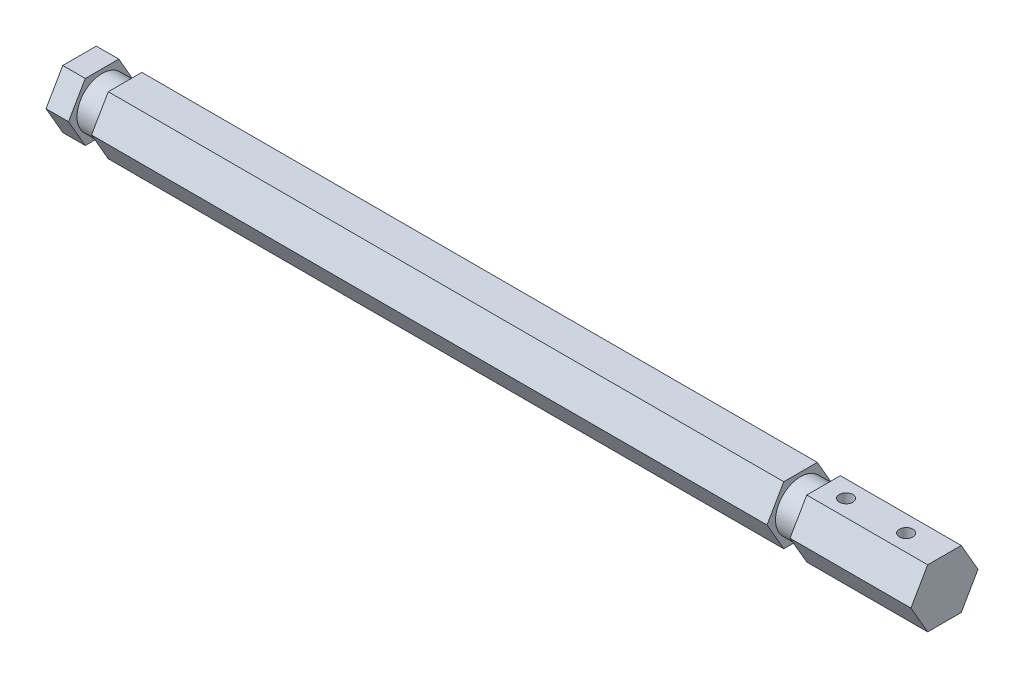
ISO-10303-21;
HEADER;
FILE_DESCRIPTION(('STEP AP214'),'2;1');
FILE_NAME('part.step','',(''),(''),'','','');
FILE_SCHEMA(('AUTOMOTIVE_DESIGN { 1 0 10303 214 1 1 1 1 }'));
ENDSEC;
DATA;
#1=APPLICATION_CONTEXT('core data for automotive mechanical design processes');
#2=APPLICATION_PROTOCOL_DEFINITION('international standard','automotive_design',2000,#1);
#3=PRODUCT_CONTEXT('',#1,'mechanical');
#4=PRODUCT('Part','Part','',(#3));
#5=PRODUCT_RELATED_PRODUCT_CATEGORY('part','',(#4));
#6=PRODUCT_DEFINITION_FORMATION('','',#4);
#7=PRODUCT_DEFINITION_CONTEXT('part definition',#1,'design');
#8=PRODUCT_DEFINITION('design','',#6,#7);
#9=PRODUCT_DEFINITION_SHAPE('','',#8);
#10=(LENGTH_UNIT() NAMED_UNIT(*) SI_UNIT(.MILLI.,.METRE.));
#11=(NAMED_UNIT(*) PLANE_ANGLE_UNIT() SI_UNIT($,.RADIAN.));
#12=(NAMED_UNIT(*) SI_UNIT($,.STERADIAN.) SOLID_ANGLE_UNIT());
#13=UNCERTAINTY_MEASURE_WITH_UNIT(LENGTH_MEASURE(1.E-05),#10,'distance_accuracy_value','');
#14=(GEOMETRIC_REPRESENTATION_CONTEXT(3) GLOBAL_UNCERTAINTY_ASSIGNED_CONTEXT((#13)) GLOBAL_UNIT_ASSIGNED_CONTEXT((#10,
#11,#12)) REPRESENTATION_CONTEXT('',''));
#15=CARTESIAN_POINT('',(0.,0.,0.));
#16=DIRECTION('',(0.,0.,1.));
#17=DIRECTION('',(1.,0.,0.));
#18=AXIS2_PLACEMENT_3D('',#15,#16,#17);
#19=CARTESIAN_POINT('',(96.03,-6.45,-3.72390923627309));
#20=DIRECTION('',(0.,0.5,0.866025403784439));
#21=DIRECTION('',(0.,-0.866025403784439,0.5));
#22=AXIS2_PLACEMENT_3D('',#19,#20,#21);
#23=PLANE('',#22);
#24=DIRECTION('',(0.,0.866025403784439,-0.5));
#25=VECTOR('',#24,1.);
#26=CARTESIAN_POINT('',(-91.03,-6.45,-3.72390923627309));
#27=LINE('',#26,#25);
#28=CARTESIAN_POINT('',(-91.03,-6.45,-3.72390923627309));
#29=VERTEX_POINT('',#28);
#30=CARTESIAN_POINT('',(-91.03,0.,-7.44781847254618));
#31=VERTEX_POINT('',#30);
#32=EDGE_CURVE('E221',#29,#31,#27,.T.);
#33=ORIENTED_EDGE('',*,*,#32,.F.);
#34=DIRECTION('',(-1.,0.,0.));
#35=VECTOR('',#34,1.);
#36=CARTESIAN_POINT('',(96.03,-6.45,-3.72390923627309));
#37=LINE('',#36,#35);
#38=CARTESIAN_POINT('',(-96.03,-6.45,-3.72390923627309));
#39=VERTEX_POINT('',#38);
#40=EDGE_CURVE('E201',#29,#39,#37,.T.);
#41=ORIENTED_EDGE('',*,*,#40,.T.);
#42=DIRECTION('',(0.,0.866025403784439,-0.5));
#43=VECTOR('',#42,1.);
#44=CARTESIAN_POINT('',(-96.03,-6.45,-3.72390923627309));
#45=LINE('',#44,#43);
#46=CARTESIAN_POINT('',(-96.03,0.,-7.44781847254618));
#47=VERTEX_POINT('',#46);
#48=EDGE_CURVE('E218',#39,#47,#45,.T.);
#49=ORIENTED_EDGE('',*,*,#48,.T.);
#50=DIRECTION('',(-1.,0.,0.));
#51=VECTOR('',#50,1.);
#52=CARTESIAN_POINT('',(96.03,0.,-7.44781847254618));
#53=LINE('',#52,#51);
#54=EDGE_CURVE('E260',#31,#47,#53,.T.);
#55=ORIENTED_EDGE('',*,*,#54,.F.);
#56=EDGE_LOOP('',(#33,#41,#49,#55));
#57=FACE_BOUND('',#56,.T.);
#58=ADVANCED_FACE('F37',(#57),#23,.F.);
#59=CARTESIAN_POINT('',(96.03,0.,-7.44781847254618));
#60=DIRECTION('',(0.,-0.5,0.866025403784438));
#61=DIRECTION('',(0.,-0.866025403784439,-0.5));
#62=AXIS2_PLACEMENT_3D('',#59,#60,#61);
#63=PLANE('',#62);
#64=DIRECTION('',(0.,0.866025403784439,0.5));
#65=VECTOR('',#64,1.);
#66=CARTESIAN_POINT('',(-91.03,0.,-7.44781847254618));
#67=LINE('',#66,#65);
#68=CARTESIAN_POINT('',(-91.03,6.45,-3.72390923627309));
#69=VERTEX_POINT('',#68);
#70=EDGE_CURVE('E306',#31,#69,#67,.T.);
#71=ORIENTED_EDGE('',*,*,#70,.F.);
#72=ORIENTED_EDGE('',*,*,#54,.T.);
#73=DIRECTION('',(0.,0.866025403784438,0.5));
#74=VECTOR('',#73,1.);
#75=CARTESIAN_POINT('',(-96.03,0.,-7.44781847254618));
#76=LINE('',#75,#74);
#77=CARTESIAN_POINT('',(-96.03,6.45,-3.72390923627309));
#78=VERTEX_POINT('',#77);
#79=EDGE_CURVE('E220',#47,#78,#76,.T.);
#80=ORIENTED_EDGE('',*,*,#79,.T.);
#81=DIRECTION('',(-1.,0.,0.));
#82=VECTOR('',#81,1.);
#83=CARTESIAN_POINT('',(96.03,6.45,-3.72390923627309));
#84=LINE('',#83,#82);
#85=EDGE_CURVE('E256',#69,#78,#84,.T.);
#86=ORIENTED_EDGE('',*,*,#85,.F.);
#87=EDGE_LOOP('',(#71,#72,#80,#86));
#88=FACE_BOUND('',#87,.T.);
#89=ADVANCED_FACE('F313',(#88),#63,.F.);
#90=CARTESIAN_POINT('',(96.03,6.45,-3.72390923627309));
#91=DIRECTION('',(0.,-1.,0.));
#92=DIRECTION('',(0.,0.,-1.));
#93=AXIS2_PLACEMENT_3D('',#90,#91,#92);
#94=PLANE('',#93);
#95=DIRECTION('',(0.,0.,1.));
#96=VECTOR('',#95,1.);
#97=CARTESIAN_POINT('',(-91.03,6.45,-3.72390923627309));
#98=LINE('',#97,#96);
#99=CARTESIAN_POINT('',(-91.03,6.45,3.72390923627309));
#100=VERTEX_POINT('',#99);
#101=EDGE_CURVE('E305',#69,#100,#98,.T.);
#102=ORIENTED_EDGE('',*,*,#101,.F.);
#103=ORIENTED_EDGE('',*,*,#85,.T.);
#104=DIRECTION('',(0.,0.,1.));
#105=VECTOR('',#104,1.);
#106=CARTESIAN_POINT('',(-96.03,6.45,-3.72390923627309));
#107=LINE('',#106,#105);
#108=CARTESIAN_POINT('',(-96.03,6.45,3.72390923627309));
#109=VERTEX_POINT('',#108);
#110=EDGE_CURVE('E224',#78,#109,#107,.T.);
#111=ORIENTED_EDGE('',*,*,#110,.T.);
#112=DIRECTION('',(-1.,0.,0.));
#113=VECTOR('',#112,1.);
#114=CARTESIAN_POINT('',(96.03,6.45,3.72390923627309));
#115=LINE('',#114,#113);
#116=EDGE_CURVE('E250',#100,#109,#115,.T.);
#117=ORIENTED_EDGE('',*,*,#116,.F.);
#118=EDGE_LOOP('',(#102,#103,#111,#117));
#119=FACE_BOUND('',#118,.T.);
#120=ADVANCED_FACE('F375',(#119),#94,.F.);
#121=CARTESIAN_POINT('',(96.03,6.45,3.72390923627309));
#122=DIRECTION('',(0.,-0.5,-0.866025403784438));
#123=DIRECTION('',(0.,0.866025403784439,-0.5));
#124=AXIS2_PLACEMENT_3D('',#121,#122,#123);
#125=PLANE('',#124);
#126=DIRECTION('',(0.,-0.866025403784439,0.5));
#127=VECTOR('',#126,1.);
#128=CARTESIAN_POINT('',(-91.03,6.45,3.72390923627309));
#129=LINE('',#128,#127);
#130=CARTESIAN_POINT('',(-91.03,0.,7.44781847254617));
#131=VERTEX_POINT('',#130);
#132=EDGE_CURVE('E303',#100,#131,#129,.T.);
#133=ORIENTED_EDGE('',*,*,#132,.F.);
#134=ORIENTED_EDGE('',*,*,#116,.T.);
#135=DIRECTION('',(0.,-0.866025403784439,0.5));
#136=VECTOR('',#135,1.);
#137=CARTESIAN_POINT('',(-96.03,6.45,3.72390923627309));
#138=LINE('',#137,#136);
#139=CARTESIAN_POINT('',(-96.03,0.,7.44781847254617));
#140=VERTEX_POINT('',#139);
#141=EDGE_CURVE('E227',#109,#140,#138,.T.);
#142=ORIENTED_EDGE('',*,*,#141,.T.);
#143=DIRECTION('',(-1.,0.,0.));
#144=VECTOR('',#143,1.);
#145=CARTESIAN_POINT('',(96.03,0.,7.44781847254617));
#146=LINE('',#145,#144);
#147=EDGE_CURVE('E187',#131,#140,#146,.T.);
#148=ORIENTED_EDGE('',*,*,#147,.F.);
#149=EDGE_LOOP('',(#133,#134,#142,#148));
#150=FACE_BOUND('',#149,.T.);
#151=ADVANCED_FACE('F406',(#150),#125,.F.);
#152=CARTESIAN_POINT('',(96.03,0.,7.44781847254617));
#153=DIRECTION('',(0.,0.5,-0.866025403784438));
#154=DIRECTION('',(0.,0.866025403784439,0.5));
#155=AXIS2_PLACEMENT_3D('',#152,#153,#154);
#156=PLANE('',#155);
#157=DIRECTION('',(0.,-0.866025403784439,-0.5));
#158=VECTOR('',#157,1.);
#159=CARTESIAN_POINT('',(-91.03,0.,7.44781847254617));
#160=LINE('',#159,#158);
#161=CARTESIAN_POINT('',(-91.0299999999999,-6.45,3.72390923627308));
#162=VERTEX_POINT('',#161);
#163=EDGE_CURVE('E50',#131,#162,#160,.T.);
#164=ORIENTED_EDGE('',*,*,#163,.F.);
#165=ORIENTED_EDGE('',*,*,#147,.T.);
#166=DIRECTION('',(0.,-0.866025403784438,-0.5));
#167=VECTOR('',#166,1.);
#168=CARTESIAN_POINT('',(-96.03,0.,7.44781847254617));
#169=LINE('',#168,#167);
#170=CARTESIAN_POINT('',(-96.03,-6.45,3.72390923627308));
#171=VERTEX_POINT('',#170);
#172=EDGE_CURVE('E230',#140,#171,#169,.T.);
#173=ORIENTED_EDGE('',*,*,#172,.T.);
#174=DIRECTION('',(-1.,0.,0.));
#175=VECTOR('',#174,1.);
#176=CARTESIAN_POINT('',(96.03,-6.45,3.72390923627308));
#177=LINE('',#176,#175);
#178=EDGE_CURVE('E190',#162,#171,#177,.T.);
#179=ORIENTED_EDGE('',*,*,#178,.F.);
#180=EDGE_LOOP('',(#164,#165,#173,#179));
#181=FACE_BOUND('',#180,.T.);
#182=ADVANCED_FACE('F411',(#181),#156,.F.);
#183=CARTESIAN_POINT('',(96.03,-6.45,3.72390923627308));
#184=DIRECTION('',(0.,1.,0.));
#185=DIRECTION('',(0.,0.,1.));
#186=AXIS2_PLACEMENT_3D('',#183,#184,#185);
#187=PLANE('',#186);
#188=DIRECTION('',(0.,0.,-1.));
#189=VECTOR('',#188,1.);
#190=CARTESIAN_POINT('',(-91.03,-6.45,3.72390923627308));
#191=LINE('',#190,#189);
#192=EDGE_CURVE('E11',#162,#29,#191,.T.);
#193=ORIENTED_EDGE('',*,*,#192,.F.);
#194=ORIENTED_EDGE('',*,*,#178,.T.);
#195=DIRECTION('',(0.,0.,-1.));
#196=VECTOR('',#195,1.);
#197=CARTESIAN_POINT('',(-96.03,-6.45,3.72390923627308));
#198=LINE('',#197,#196);
#199=EDGE_CURVE('E231',#171,#39,#198,.T.);
#200=ORIENTED_EDGE('',*,*,#199,.T.);
#201=ORIENTED_EDGE('',*,*,#40,.F.);
#202=EDGE_LOOP('',(#193,#194,#200,#201));
#203=FACE_BOUND('',#202,.T.);
#204=ADVANCED_FACE('F417',(#203),#187,.F.);
#205=CARTESIAN_POINT('',(-96.03,0.,0.));
#206=DIRECTION('',(1.,0.,0.));
#207=DIRECTION('',(0.,0.,-1.));
#208=AXIS2_PLACEMENT_3D('',#205,#206,#207);
#209=PLANE('',#208);
#210=ORIENTED_EDGE('',*,*,#48,.F.);
#211=ORIENTED_EDGE('',*,*,#199,.F.);
#212=ORIENTED_EDGE('',*,*,#172,.F.);
#213=ORIENTED_EDGE('',*,*,#141,.F.);
#214=ORIENTED_EDGE('',*,*,#110,.F.);
#215=ORIENTED_EDGE('',*,*,#79,.F.);
#216=EDGE_LOOP('',(#210,#211,#212,#213,#214,#215));
#217=FACE_BOUND('',#216,.T.);
#218=ADVANCED_FACE('F421',(#217),#209,.F.);
#219=CARTESIAN_POINT('',(-91.03,5.55625,0.));
#220=DIRECTION('',(1.,0.,0.));
#221=DIRECTION('',(0.,0.,-1.));
#222=AXIS2_PLACEMENT_3D('',#219,#220,#221);
#223=PLANE('',#222);
#224=CARTESIAN_POINT('',(-91.03,0.,0.));
#225=DIRECTION('',(-1.,0.,0.));
#226=DIRECTION('',(0.,0.,1.));
#227=AXIS2_PLACEMENT_3D('',#224,#225,#226);
#228=CIRCLE('',#227,5.55625);
#229=CARTESIAN_POINT('',(-91.03,0.,5.55625));
#230=VERTEX_POINT('',#229);
#231=EDGE_CURVE('E340',#230,#230,#228,.T.);
#232=ORIENTED_EDGE('',*,*,#231,.T.);
#233=EDGE_LOOP('',(#232));
#234=FACE_BOUND('',#233,.T.);
#235=ORIENTED_EDGE('',*,*,#32,.T.);
#236=ORIENTED_EDGE('',*,*,#70,.T.);
#237=ORIENTED_EDGE('',*,*,#101,.T.);
#238=ORIENTED_EDGE('',*,*,#132,.T.);
#239=ORIENTED_EDGE('',*,*,#163,.T.);
#240=ORIENTED_EDGE('',*,*,#192,.T.);
#241=EDGE_LOOP('',(#235,#236,#237,#238,#239,#240));
#242=FACE_BOUND('',#241,.T.);
#243=ADVANCED_FACE('F309',(#234,#242),#223,.T.);
#244=CARTESIAN_POINT('',(-85.9246,5.55625,0.));
#245=DIRECTION('',(-1.,0.,0.));
#246=DIRECTION('',(0.,0.,1.));
#247=AXIS2_PLACEMENT_3D('',#244,#245,#246);
#248=PLANE('',#247);
#249=CARTESIAN_POINT('',(-85.9246,0.,0.));
#250=DIRECTION('',(-1.,0.,0.));
#251=DIRECTION('',(0.,0.,1.));
#252=AXIS2_PLACEMENT_3D('',#249,#250,#251);
#253=CIRCLE('',#252,5.55625);
#254=CARTESIAN_POINT('',(-85.9246,0.,5.55625));
#255=VERTEX_POINT('',#254);
#256=EDGE_CURVE('E183',#255,#255,#253,.T.);
#257=ORIENTED_EDGE('',*,*,#256,.F.);
#258=EDGE_LOOP('',(#257));
#259=FACE_BOUND('',#258,.T.);
#260=DIRECTION('',(0.,-0.866025403784439,0.5));
#261=VECTOR('',#260,1.);
#262=CARTESIAN_POINT('',(-85.9246,-6.45,-3.72390923627309));
#263=LINE('',#262,#261);
#264=CARTESIAN_POINT('',(-85.9246,0.,-7.44781847254618));
#265=VERTEX_POINT('',#264);
#266=CARTESIAN_POINT('',(-85.9246,-6.45,-3.72390923627309));
#267=VERTEX_POINT('',#266);
#268=EDGE_CURVE('E272',#265,#267,#263,.T.);
#269=ORIENTED_EDGE('',*,*,#268,.T.);
#270=DIRECTION('',(0.,0.,1.));
#271=VECTOR('',#270,1.);
#272=CARTESIAN_POINT('',(-85.9246,-6.45,3.72390923627308));
#273=LINE('',#272,#271);
#274=CARTESIAN_POINT('',(-85.9246,-6.45,3.72390923627308));
#275=VERTEX_POINT('',#274);
#276=EDGE_CURVE('E44',#267,#275,#273,.T.);
#277=ORIENTED_EDGE('',*,*,#276,.T.);
#278=DIRECTION('',(0.,0.866025403784439,0.5));
#279=VECTOR('',#278,1.);
#280=CARTESIAN_POINT('',(-85.9246,0.,7.44781847254617));
#281=LINE('',#280,#279);
#282=CARTESIAN_POINT('',(-85.9246,0.,7.44781847254617));
#283=VERTEX_POINT('',#282);
#284=EDGE_CURVE('E269',#275,#283,#281,.T.);
#285=ORIENTED_EDGE('',*,*,#284,.T.);
#286=DIRECTION('',(0.,0.866025403784439,-0.5));
#287=VECTOR('',#286,1.);
#288=CARTESIAN_POINT('',(-85.9246,6.45,3.72390923627309));
#289=LINE('',#288,#287);
#290=CARTESIAN_POINT('',(-85.9246,6.45,3.72390923627309));
#291=VERTEX_POINT('',#290);
#292=EDGE_CURVE('E279',#283,#291,#289,.T.);
#293=ORIENTED_EDGE('',*,*,#292,.T.);
#294=DIRECTION('',(0.,0.,-1.));
#295=VECTOR('',#294,1.);
#296=CARTESIAN_POINT('',(-85.9246,6.45,-3.72390923627309));
#297=LINE('',#296,#295);
#298=CARTESIAN_POINT('',(-85.9246,6.45,-3.72390923627309));
#299=VERTEX_POINT('',#298);
#300=EDGE_CURVE('E297',#291,#299,#297,.T.);
#301=ORIENTED_EDGE('',*,*,#300,.T.);
#302=DIRECTION('',(0.,-0.866025403784439,-0.5));
#303=VECTOR('',#302,1.);
#304=CARTESIAN_POINT('',(-85.9246,0.,-7.44781847254618));
#305=LINE('',#304,#303);
#306=EDGE_CURVE('E299',#299,#265,#305,.T.);
#307=ORIENTED_EDGE('',*,*,#306,.T.);
#308=EDGE_LOOP('',(#269,#277,#285,#293,#301,#307));
#309=FACE_BOUND('',#308,.T.);
#310=ADVANCED_FACE('F268',(#259,#309),#248,.T.);
#311=CARTESIAN_POINT('',(-251.263286977946,0.,0.));
#312=DIRECTION('',(-1.,0.,0.));
#313=DIRECTION('',(0.,0.,1.));
#314=AXIS2_PLACEMENT_3D('',#311,#312,#313);
#315=CYLINDRICAL_SURFACE('',#314,5.55625);
#316=ORIENTED_EDGE('',*,*,#256,.T.);
#317=EDGE_LOOP('',(#316));
#318=FACE_BOUND('',#317,.T.);
#319=ORIENTED_EDGE('',*,*,#231,.F.);
#320=EDGE_LOOP('',(#319));
#321=FACE_BOUND('',#320,.T.);
#322=ADVANCED_FACE('F439',(#318,#321),#315,.T.);
#323=ORIENTED_EDGE('',*,*,#276,.F.);
#324=CARTESIAN_POINT('',(64.0754,-6.45,-3.72390923627309));
#325=VERTEX_POINT('',#324);
#326=EDGE_CURVE('E200',#325,#267,#37,.T.);
#327=ORIENTED_EDGE('',*,*,#326,.F.);
#328=DIRECTION('',(0.,0.,-1.));
#329=VECTOR('',#328,1.);
#330=CARTESIAN_POINT('',(64.0754,-6.45,3.72390923627308));
#331=LINE('',#330,#329);
#332=CARTESIAN_POINT('',(64.0754,-6.45,3.72390923627308));
#333=VERTEX_POINT('',#332);
#334=EDGE_CURVE('E170',#333,#325,#331,.T.);
#335=ORIENTED_EDGE('',*,*,#334,.F.);
#336=EDGE_CURVE('E188',#333,#275,#177,.T.);
#337=ORIENTED_EDGE('',*,*,#336,.T.);
#338=EDGE_LOOP('',(#323,#327,#335,#337));
#339=FACE_BOUND('',#338,.T.);
#340=ADVANCED_FACE('F282',(#339),#187,.F.);
#341=ORIENTED_EDGE('',*,*,#284,.F.);
#342=ORIENTED_EDGE('',*,*,#336,.F.);
#343=DIRECTION('',(0.,-0.866025403784439,-0.5));
#344=VECTOR('',#343,1.);
#345=CARTESIAN_POINT('',(64.0754,0.,7.44781847254617));
#346=LINE('',#345,#344);
#347=CARTESIAN_POINT('',(64.0754,0.,7.44781847254617));
#348=VERTEX_POINT('',#347);
#349=EDGE_CURVE('E58',#348,#333,#346,.T.);
#350=ORIENTED_EDGE('',*,*,#349,.F.);
#351=EDGE_CURVE('E191',#348,#283,#146,.T.);
#352=ORIENTED_EDGE('',*,*,#351,.T.);
#353=EDGE_LOOP('',(#341,#342,#350,#352));
#354=FACE_BOUND('',#353,.T.);
#355=ADVANCED_FACE('F277',(#354),#156,.F.);
#356=ORIENTED_EDGE('',*,*,#292,.F.);
#357=ORIENTED_EDGE('',*,*,#351,.F.);
#358=DIRECTION('',(0.,-0.866025403784439,0.5));
#359=VECTOR('',#358,1.);
#360=CARTESIAN_POINT('',(64.0754,6.45,3.72390923627309));
#361=LINE('',#360,#359);
#362=CARTESIAN_POINT('',(64.0754,6.45,3.72390923627309));
#363=VERTEX_POINT('',#362);
#364=EDGE_CURVE('E327',#363,#348,#361,.T.);
#365=ORIENTED_EDGE('',*,*,#364,.F.);
#366=EDGE_CURVE('E251',#363,#291,#115,.T.);
#367=ORIENTED_EDGE('',*,*,#366,.T.);
#368=EDGE_LOOP('',(#356,#357,#365,#367));
#369=FACE_BOUND('',#368,.T.);
#370=ADVANCED_FACE('F401',(#369),#125,.F.);
#371=ORIENTED_EDGE('',*,*,#300,.F.);
#372=ORIENTED_EDGE('',*,*,#366,.F.);
#373=DIRECTION('',(0.,0.,1.));
#374=VECTOR('',#373,1.);
#375=CARTESIAN_POINT('',(64.0754,6.45,-3.72390923627309));
#376=LINE('',#375,#374);
#377=CARTESIAN_POINT('',(64.0754,6.45,-3.72390923627309));
#378=VERTEX_POINT('',#377);
#379=EDGE_CURVE('E292',#378,#363,#376,.T.);
#380=ORIENTED_EDGE('',*,*,#379,.F.);
#381=EDGE_CURVE('E261',#378,#299,#84,.T.);
#382=ORIENTED_EDGE('',*,*,#381,.T.);
#383=EDGE_LOOP('',(#371,#372,#380,#382));
#384=FACE_BOUND('',#383,.T.);
#385=ADVANCED_FACE('F325',(#384),#94,.F.);
#386=ORIENTED_EDGE('',*,*,#306,.F.);
#387=ORIENTED_EDGE('',*,*,#381,.F.);
#388=DIRECTION('',(0.,0.866025403784439,0.5));
#389=VECTOR('',#388,1.);
#390=CARTESIAN_POINT('',(64.0754,0.,-7.44781847254618));
#391=LINE('',#390,#389);
#392=CARTESIAN_POINT('',(64.0754,0.,-7.44781847254618));
#393=VERTEX_POINT('',#392);
#394=EDGE_CURVE('E290',#393,#378,#391,.T.);
#395=ORIENTED_EDGE('',*,*,#394,.F.);
#396=EDGE_CURVE('E263',#393,#265,#53,.T.);
#397=ORIENTED_EDGE('',*,*,#396,.T.);
#398=EDGE_LOOP('',(#386,#387,#395,#397));
#399=FACE_BOUND('',#398,.T.);
#400=ADVANCED_FACE('F317',(#399),#63,.F.);
#401=ORIENTED_EDGE('',*,*,#268,.F.);
#402=ORIENTED_EDGE('',*,*,#396,.F.);
#403=DIRECTION('',(0.,0.866025403784439,-0.5));
#404=VECTOR('',#403,1.);
#405=CARTESIAN_POINT('',(64.0754,-6.45,-3.72390923627309));
#406=LINE('',#405,#404);
#407=EDGE_CURVE('E280',#325,#393,#406,.T.);
#408=ORIENTED_EDGE('',*,*,#407,.F.);
#409=ORIENTED_EDGE('',*,*,#326,.T.);
#410=EDGE_LOOP('',(#401,#402,#408,#409));
#411=FACE_BOUND('',#410,.T.);
#412=ADVANCED_FACE('F288',(#411),#23,.F.);
#413=CARTESIAN_POINT('',(64.0754,5.55625,0.));
#414=DIRECTION('',(1.,0.,0.));
#415=DIRECTION('',(0.,0.,-1.));
#416=AXIS2_PLACEMENT_3D('',#413,#414,#415);
#417=PLANE('',#416);
#418=CARTESIAN_POINT('',(64.0754,0.,0.));
#419=DIRECTION('',(-1.,0.,0.));
#420=DIRECTION('',(0.,0.,1.));
#421=AXIS2_PLACEMENT_3D('',#418,#419,#420);
#422=CIRCLE('',#421,5.55625);
#423=CARTESIAN_POINT('',(64.0754,0.,5.55625));
#424=VERTEX_POINT('',#423);
#425=EDGE_CURVE('E341',#424,#424,#422,.T.);
#426=ORIENTED_EDGE('',*,*,#425,.T.);
#427=EDGE_LOOP('',(#426));
#428=FACE_BOUND('',#427,.T.);
#429=ORIENTED_EDGE('',*,*,#407,.T.);
#430=ORIENTED_EDGE('',*,*,#394,.T.);
#431=ORIENTED_EDGE('',*,*,#379,.T.);
#432=ORIENTED_EDGE('',*,*,#364,.T.);
#433=ORIENTED_EDGE('',*,*,#349,.T.);
#434=ORIENTED_EDGE('',*,*,#334,.T.);
#435=EDGE_LOOP('',(#429,#430,#431,#432,#433,#434));
#436=FACE_BOUND('',#435,.T.);
#437=ADVANCED_FACE('F284',(#428,#436),#417,.T.);
#438=CARTESIAN_POINT('',(69.1808,5.55625,0.));
#439=DIRECTION('',(-1.,0.,0.));
#440=DIRECTION('',(0.,0.,1.));
#441=AXIS2_PLACEMENT_3D('',#438,#439,#440);
#442=PLANE('',#441);
#443=CARTESIAN_POINT('',(69.1808,0.,0.));
#444=DIRECTION('',(-1.,0.,0.));
#445=DIRECTION('',(0.,0.,1.));
#446=AXIS2_PLACEMENT_3D('',#443,#444,#445);
#447=CIRCLE('',#446,5.55625);
#448=CARTESIAN_POINT('',(69.1808,0.,5.55625));
#449=VERTEX_POINT('',#448);
#450=EDGE_CURVE('E337',#449,#449,#447,.T.);
#451=ORIENTED_EDGE('',*,*,#450,.F.);
#452=EDGE_LOOP('',(#451));
#453=FACE_BOUND('',#452,.T.);
#454=DIRECTION('',(0.,-0.866025403784439,0.5));
#455=VECTOR('',#454,1.);
#456=CARTESIAN_POINT('',(69.1808,-6.45,-3.72390923627309));
#457=LINE('',#456,#455);
#458=CARTESIAN_POINT('',(69.1808,0.,-7.44781847254618));
#459=VERTEX_POINT('',#458);
#460=CARTESIAN_POINT('',(69.1808,-6.45,-3.72390923627309));
#461=VERTEX_POINT('',#460);
#462=EDGE_CURVE('E165',#459,#461,#457,.T.);
#463=ORIENTED_EDGE('',*,*,#462,.T.);
#464=DIRECTION('',(0.,0.,1.));
#465=VECTOR('',#464,1.);
#466=CARTESIAN_POINT('',(69.1808,-6.45,3.72390923627308));
#467=LINE('',#466,#465);
#468=CARTESIAN_POINT('',(69.1808,-6.45,3.72390923627308));
#469=VERTEX_POINT('',#468);
#470=EDGE_CURVE('E159',#461,#469,#467,.T.);
#471=ORIENTED_EDGE('',*,*,#470,.T.);
#472=DIRECTION('',(0.,0.866025403784439,0.5));
#473=VECTOR('',#472,1.);
#474=CARTESIAN_POINT('',(69.1808,0.,7.44781847254617));
#475=LINE('',#474,#473);
#476=CARTESIAN_POINT('',(69.1808,0.,7.44781847254617));
#477=VERTEX_POINT('',#476);
#478=EDGE_CURVE('E162',#469,#477,#475,.T.);
#479=ORIENTED_EDGE('',*,*,#478,.T.);
#480=DIRECTION('',(0.,0.866025403784439,-0.5));
#481=VECTOR('',#480,1.);
#482=CARTESIAN_POINT('',(69.1808,6.45,3.72390923627309));
#483=LINE('',#482,#481);
#484=CARTESIAN_POINT('',(69.1808,6.45,3.72390923627309));
#485=VERTEX_POINT('',#484);
#486=EDGE_CURVE('E182',#477,#485,#483,.T.);
#487=ORIENTED_EDGE('',*,*,#486,.T.);
#488=DIRECTION('',(0.,0.,-1.));
#489=VECTOR('',#488,1.);
#490=CARTESIAN_POINT('',(69.1808,6.45,-3.72390923627309));
#491=LINE('',#490,#489);
#492=CARTESIAN_POINT('',(69.1808,6.45,-3.72390923627309));
#493=VERTEX_POINT('',#492);
#494=EDGE_CURVE('E334',#485,#493,#491,.T.);
#495=ORIENTED_EDGE('',*,*,#494,.T.);
#496=DIRECTION('',(0.,-0.866025403784439,-0.5));
#497=VECTOR('',#496,1.);
#498=CARTESIAN_POINT('',(69.1808,0.,-7.44781847254618));
#499=LINE('',#498,#497);
#500=EDGE_CURVE('E332',#493,#459,#499,.T.);
#501=ORIENTED_EDGE('',*,*,#500,.T.);
#502=EDGE_LOOP('',(#463,#471,#479,#487,#495,#501));
#503=FACE_BOUND('',#502,.T.);
#504=ADVANCED_FACE('F161',(#453,#503),#442,.T.);
#505=CARTESIAN_POINT('',(-251.263286977946,0.,0.));
#506=DIRECTION('',(-1.,0.,0.));
#507=DIRECTION('',(0.,0.,1.));
#508=AXIS2_PLACEMENT_3D('',#505,#506,#507);
#509=CYLINDRICAL_SURFACE('',#508,5.55625);
#510=ORIENTED_EDGE('',*,*,#450,.T.);
#511=EDGE_LOOP('',(#510));
#512=FACE_BOUND('',#511,.T.);
#513=ORIENTED_EDGE('',*,*,#425,.F.);
#514=EDGE_LOOP('',(#513));
#515=FACE_BOUND('',#514,.T.);
#516=ADVANCED_FACE('F426',(#512,#515),#509,.T.);
#517=CARTESIAN_POINT('',(96.03,0.,0.));
#518=DIRECTION('',(1.,0.,0.));
#519=DIRECTION('',(0.,0.,-1.));
#520=AXIS2_PLACEMENT_3D('',#517,#518,#519);
#521=PLANE('',#520);
#522=DIRECTION('',(0.,0.866025403784439,-0.5));
#523=VECTOR('',#522,1.);
#524=CARTESIAN_POINT('',(96.03,-6.45,-3.72390923627309));
#525=LINE('',#524,#523);
#526=CARTESIAN_POINT('',(96.03,-6.45,-3.72390923627309));
#527=VERTEX_POINT('',#526);
#528=CARTESIAN_POINT('',(96.03,0.,-7.44781847254618));
#529=VERTEX_POINT('',#528);
#530=EDGE_CURVE('E232',#527,#529,#525,.T.);
#531=ORIENTED_EDGE('',*,*,#530,.T.);
#532=DIRECTION('',(0.,0.866025403784438,0.5));
#533=VECTOR('',#532,1.);
#534=CARTESIAN_POINT('',(96.03,0.,-7.44781847254618));
#535=LINE('',#534,#533);
#536=CARTESIAN_POINT('',(96.03,6.45,-3.72390923627309));
#537=VERTEX_POINT('',#536);
#538=EDGE_CURVE('E235',#529,#537,#535,.T.);
#539=ORIENTED_EDGE('',*,*,#538,.T.);
#540=DIRECTION('',(0.,0.,1.));
#541=VECTOR('',#540,1.);
#542=CARTESIAN_POINT('',(96.03,6.45,-3.72390923627309));
#543=LINE('',#542,#541);
#544=CARTESIAN_POINT('',(96.03,6.45,3.72390923627309));
#545=VERTEX_POINT('',#544);
#546=EDGE_CURVE('E238',#537,#545,#543,.T.);
#547=ORIENTED_EDGE('',*,*,#546,.T.);
#548=DIRECTION('',(0.,-0.866025403784439,0.5));
#549=VECTOR('',#548,1.);
#550=CARTESIAN_POINT('',(96.03,6.45,3.72390923627309));
#551=LINE('',#550,#549);
#552=CARTESIAN_POINT('',(96.03,0.,7.44781847254617));
#553=VERTEX_POINT('',#552);
#554=EDGE_CURVE('E214',#545,#553,#551,.T.);
#555=ORIENTED_EDGE('',*,*,#554,.T.);
#556=DIRECTION('',(0.,-0.866025403784438,-0.5));
#557=VECTOR('',#556,1.);
#558=CARTESIAN_POINT('',(96.03,0.,7.44781847254617));
#559=LINE('',#558,#557);
#560=CARTESIAN_POINT('',(96.03,-6.45,3.72390923627308));
#561=VERTEX_POINT('',#560);
#562=EDGE_CURVE('E210',#553,#561,#559,.T.);
#563=ORIENTED_EDGE('',*,*,#562,.T.);
#564=DIRECTION('',(0.,0.,-1.));
#565=VECTOR('',#564,1.);
#566=CARTESIAN_POINT('',(96.03,-6.45,3.72390923627308));
#567=LINE('',#566,#565);
#568=EDGE_CURVE('E186',#561,#527,#567,.T.);
#569=ORIENTED_EDGE('',*,*,#568,.T.);
#570=EDGE_LOOP('',(#531,#539,#547,#555,#563,#569));
#571=FACE_BOUND('',#570,.T.);
#572=ADVANCED_FACE('F244',(#571),#521,.T.);
#573=CARTESIAN_POINT('',(74.1808,-6.45,0.));
#574=DIRECTION('',(0.,1.,0.));
#575=DIRECTION('',(0.,0.,1.));
#576=AXIS2_PLACEMENT_3D('',#573,#574,#575);
#577=CIRCLE('',#576,1.5);
#578=CARTESIAN_POINT('',(74.1808,-6.45,1.5));
#579=VERTEX_POINT('',#578);
#580=EDGE_CURVE('E344',#579,#579,#577,.T.);
#581=ORIENTED_EDGE('',*,*,#580,.T.);
#582=EDGE_LOOP('',(#581));
#583=FACE_BOUND('',#582,.T.);
#584=CARTESIAN_POINT('',(87.5308,-6.45,0.));
#585=DIRECTION('',(0.,1.,0.));
#586=DIRECTION('',(0.,0.,1.));
#587=AXIS2_PLACEMENT_3D('',#584,#585,#586);
#588=CIRCLE('',#587,1.5);
#589=CARTESIAN_POINT('',(87.5308,-6.45,1.5));
#590=VERTEX_POINT('',#589);
#591=EDGE_CURVE('E352',#590,#590,#588,.T.);
#592=ORIENTED_EDGE('',*,*,#591,.T.);
#593=EDGE_LOOP('',(#592));
#594=FACE_BOUND('',#593,.T.);
#595=ORIENTED_EDGE('',*,*,#470,.F.);
#596=EDGE_CURVE('E195',#527,#461,#37,.T.);
#597=ORIENTED_EDGE('',*,*,#596,.F.);
#598=ORIENTED_EDGE('',*,*,#568,.F.);
#599=EDGE_CURVE('E178',#561,#469,#177,.T.);
#600=ORIENTED_EDGE('',*,*,#599,.T.);
#601=EDGE_LOOP('',(#595,#597,#598,#600));
#602=FACE_BOUND('',#601,.T.);
#603=ADVANCED_FACE('F185',(#583,#594,#602),#187,.F.);
#604=ORIENTED_EDGE('',*,*,#478,.F.);
#605=ORIENTED_EDGE('',*,*,#599,.F.);
#606=ORIENTED_EDGE('',*,*,#562,.F.);
#607=EDGE_CURVE('E181',#553,#477,#146,.T.);
#608=ORIENTED_EDGE('',*,*,#607,.T.);
#609=EDGE_LOOP('',(#604,#605,#606,#608));
#610=FACE_BOUND('',#609,.T.);
#611=ADVANCED_FACE('F176',(#610),#156,.F.);
#612=ORIENTED_EDGE('',*,*,#486,.F.);
#613=ORIENTED_EDGE('',*,*,#607,.F.);
#614=ORIENTED_EDGE('',*,*,#554,.F.);
#615=EDGE_CURVE('E253',#545,#485,#115,.T.);
#616=ORIENTED_EDGE('',*,*,#615,.T.);
#617=EDGE_LOOP('',(#612,#613,#614,#616));
#618=FACE_BOUND('',#617,.T.);
#619=ADVANCED_FACE('F249',(#618),#125,.F.);
#620=CARTESIAN_POINT('',(74.1808,6.45,0.));
#621=DIRECTION('',(0.,1.,0.));
#622=DIRECTION('',(0.,0.,1.));
#623=AXIS2_PLACEMENT_3D('',#620,#621,#622);
#624=CIRCLE('',#623,1.5);
#625=CARTESIAN_POINT('',(74.1808,6.45,1.5));
#626=VERTEX_POINT('',#625);
#627=EDGE_CURVE('E355',#626,#626,#624,.T.);
#628=ORIENTED_EDGE('',*,*,#627,.F.);
#629=EDGE_LOOP('',(#628));
#630=FACE_BOUND('',#629,.T.);
#631=CARTESIAN_POINT('',(87.5308,6.45,0.));
#632=DIRECTION('',(0.,1.,0.));
#633=DIRECTION('',(0.,0.,1.));
#634=AXIS2_PLACEMENT_3D('',#631,#632,#633);
#635=CIRCLE('',#634,1.5);
#636=CARTESIAN_POINT('',(87.5308,6.45,1.5));
#637=VERTEX_POINT('',#636);
#638=EDGE_CURVE('E349',#637,#637,#635,.T.);
#639=ORIENTED_EDGE('',*,*,#638,.F.);
#640=EDGE_LOOP('',(#639));
#641=FACE_BOUND('',#640,.T.);
#642=ORIENTED_EDGE('',*,*,#494,.F.);
#643=ORIENTED_EDGE('',*,*,#615,.F.);
#644=ORIENTED_EDGE('',*,*,#546,.F.);
#645=EDGE_CURVE('E257',#537,#493,#84,.T.);
#646=ORIENTED_EDGE('',*,*,#645,.T.);
#647=EDGE_LOOP('',(#642,#643,#644,#646));
#648=FACE_BOUND('',#647,.T.);
#649=ADVANCED_FACE('F370',(#630,#641,#648),#94,.F.);
#650=ORIENTED_EDGE('',*,*,#500,.F.);
#651=ORIENTED_EDGE('',*,*,#645,.F.);
#652=ORIENTED_EDGE('',*,*,#538,.F.);
#653=EDGE_CURVE('E171',#529,#459,#53,.T.);
#654=ORIENTED_EDGE('',*,*,#653,.T.);
#655=EDGE_LOOP('',(#650,#651,#652,#654));
#656=FACE_BOUND('',#655,.T.);
#657=ADVANCED_FACE('F373',(#656),#63,.F.);
#658=ORIENTED_EDGE('',*,*,#462,.F.);
#659=ORIENTED_EDGE('',*,*,#653,.F.);
#660=ORIENTED_EDGE('',*,*,#530,.F.);
#661=ORIENTED_EDGE('',*,*,#596,.T.);
#662=EDGE_LOOP('',(#658,#659,#660,#661));
#663=FACE_BOUND('',#662,.T.);
#664=ADVANCED_FACE('F382',(#663),#23,.F.);
#665=CARTESIAN_POINT('',(87.5308,-6.45,0.));
#666=DIRECTION('',(0.,1.,0.));
#667=DIRECTION('',(0.,0.,1.));
#668=AXIS2_PLACEMENT_3D('',#665,#666,#667);
#669=CYLINDRICAL_SURFACE('',#668,1.5);
#670=CARTESIAN_POINT('',(87.5308,-6.45,1.5));
#671=CARTESIAN_POINT('',(87.5308,-6.315625,1.5));
#672=CARTESIAN_POINT('',(87.5308,-6.18125,1.5));
#673=CARTESIAN_POINT('',(87.5308,-5.9125,1.5));
#674=CARTESIAN_POINT('',(87.5308,-5.778125,1.5));
#675=CARTESIAN_POINT('',(87.5308,-5.509375,1.5));
#676=CARTESIAN_POINT('',(87.5308,-5.375,1.5));
#677=CARTESIAN_POINT('',(87.5308,-5.10625,1.5));
#678=CARTESIAN_POINT('',(87.5308,-4.971875,1.5));
#679=CARTESIAN_POINT('',(87.5308,-4.703125,1.5));
#680=CARTESIAN_POINT('',(87.5308,-4.56875,1.5));
#681=CARTESIAN_POINT('',(87.5308,-4.3,1.5));
#682=CARTESIAN_POINT('',(87.5308,-4.165625,1.5));
#683=CARTESIAN_POINT('',(87.5308,-3.896875,1.5));
#684=CARTESIAN_POINT('',(87.5308,-3.7625,1.5));
#685=CARTESIAN_POINT('',(87.5308,-3.49375,1.5));
#686=CARTESIAN_POINT('',(87.5308,-3.359375,1.5));
#687=CARTESIAN_POINT('',(87.5308,-3.090625,1.5));
#688=CARTESIAN_POINT('',(87.5308,-2.95625,1.5));
#689=CARTESIAN_POINT('',(87.5308,-2.6875,1.5));
#690=CARTESIAN_POINT('',(87.5308,-2.553125,1.5));
#691=CARTESIAN_POINT('',(87.5308,-2.284375,1.5));
#692=CARTESIAN_POINT('',(87.5308,-2.15,1.5));
#693=CARTESIAN_POINT('',(87.5308,-1.88125,1.5));
#694=CARTESIAN_POINT('',(87.5308,-1.746875,1.5));
#695=CARTESIAN_POINT('',(87.5308,-1.478125,1.5));
#696=CARTESIAN_POINT('',(87.5308,-1.34375,1.5));
#697=CARTESIAN_POINT('',(87.5308,-1.075,1.5));
#698=CARTESIAN_POINT('',(87.5308,-0.940624999999999,1.5));
#699=CARTESIAN_POINT('',(87.5308,-0.671874999999999,1.5));
#700=CARTESIAN_POINT('',(87.5308,-0.537499999999999,1.5));
#701=CARTESIAN_POINT('',(87.5308,-0.268749999999999,1.5));
#702=CARTESIAN_POINT('',(87.5308,-0.134374999999999,1.5));
#703=CARTESIAN_POINT('',(87.5308,0.134375000000001,1.5));
#704=CARTESIAN_POINT('',(87.5308,0.268750000000001,1.5));
#705=CARTESIAN_POINT('',(87.5308,0.537500000000001,1.5));
#706=CARTESIAN_POINT('',(87.5308,0.671875000000001,1.5));
#707=CARTESIAN_POINT('',(87.5308,0.940625000000001,1.5));
#708=CARTESIAN_POINT('',(87.5308,1.075,1.5));
#709=CARTESIAN_POINT('',(87.5308,1.34375,1.5));
#710=CARTESIAN_POINT('',(87.5308,1.478125,1.5));
#711=CARTESIAN_POINT('',(87.5308,1.746875,1.5));
#712=CARTESIAN_POINT('',(87.5308,1.88125,1.5));
#713=CARTESIAN_POINT('',(87.5308,2.15,1.5));
#714=CARTESIAN_POINT('',(87.5308,2.284375,1.5));
#715=CARTESIAN_POINT('',(87.5308,2.553125,1.5));
#716=CARTESIAN_POINT('',(87.5308,2.6875,1.5));
#717=CARTESIAN_POINT('',(87.5308,2.95625,1.5));
#718=CARTESIAN_POINT('',(87.5308,3.090625,1.5));
#719=CARTESIAN_POINT('',(87.5308,3.359375,1.5));
#720=CARTESIAN_POINT('',(87.5308,3.49375,1.5));
#721=CARTESIAN_POINT('',(87.5308,3.7625,1.5));
#722=CARTESIAN_POINT('',(87.5308,3.896875,1.5));
#723=CARTESIAN_POINT('',(87.5308,4.165625,1.5));
#724=CARTESIAN_POINT('',(87.5308,4.3,1.5));
#725=CARTESIAN_POINT('',(87.5308,4.56875,1.5));
#726=CARTESIAN_POINT('',(87.5308,4.703125,1.5));
#727=CARTESIAN_POINT('',(87.5308,4.971875,1.5));
#728=CARTESIAN_POINT('',(87.5308,5.10625,1.5));
#729=CARTESIAN_POINT('',(87.5308,5.375,1.5));
#730=CARTESIAN_POINT('',(87.5308,5.509375,1.5));
#731=CARTESIAN_POINT('',(87.5308,5.778125,1.5));
#732=CARTESIAN_POINT('',(87.5308,5.9125,1.5));
#733=CARTESIAN_POINT('',(87.5308,6.18125,1.5));
#734=CARTESIAN_POINT('',(87.5308,6.315625,1.5));
#735=CARTESIAN_POINT('',(87.5308,6.45,1.5));
#736=B_SPLINE_CURVE_WITH_KNOTS('',3,(#670,#671,#672,#673,#674,#675,#676,#677,#678,#679,#680,
#681,#682,#683,#684,#685,#686,#687,#688,#689,#690,#691,#692,#693,#694,#695,#696,#697,#698,#699,
#700,#701,#702,#703,#704,#705,#706,#707,#708,#709,#710,#711,#712,#713,#714,#715,#716,#717,#718,
#719,#720,#721,#722,#723,#724,#725,#726,#727,#728,#729,#730,#731,#732,#733,#734,#735),
.UNSPECIFIED.,.F.,.F.,(4,2,2,2,2,2,2,2,2,2,2,2,2,2,2,2,2,2,2,2,2,2,2,2,2,2,2,2,2,2,2,2,4),(0.,
0.403125,0.80625,1.209375,1.6125,2.015625,2.41875,2.821875,3.225,3.628125,4.03125,4.434375,
4.8375,5.240625,5.64375,6.046875,6.45,6.853125,7.25625,7.659375,8.0625,8.465625,8.86875,
9.271875,9.675,10.078125,10.48125,10.884375,11.2875,11.690625,12.09375,12.496875,12.9),.UNSPECIFIED.);
#737=EDGE_CURVE('BSEAM366',#590,#637,#736,.T.);
#738=ORIENTED_EDGE('',*,*,#591,.F.);
#739=ORIENTED_EDGE('',*,*,#638,.T.);
#740=ORIENTED_EDGE('',*,*,#737,.T.);
#741=ORIENTED_EDGE('',*,*,#737,.F.);
#742=EDGE_LOOP('',(#738,#740,#739,#741));
#743=FACE_BOUND('',#742,.T.);
#744=ADVANCED_FACE('F366',(#743),#669,.F.);
#745=CARTESIAN_POINT('',(74.1808,-6.45,0.));
#746=DIRECTION('',(0.,1.,0.));
#747=DIRECTION('',(0.,0.,1.));
#748=AXIS2_PLACEMENT_3D('',#745,#746,#747);
#749=CYLINDRICAL_SURFACE('',#748,1.5);
#750=CARTESIAN_POINT('',(74.1808,-6.45,1.5));
#751=CARTESIAN_POINT('',(74.1808,-6.315625,1.5));
#752=CARTESIAN_POINT('',(74.1808,-6.18125,1.5));
#753=CARTESIAN_POINT('',(74.1808,-5.9125,1.5));
#754=CARTESIAN_POINT('',(74.1808,-5.778125,1.5));
#755=CARTESIAN_POINT('',(74.1808,-5.509375,1.5));
#756=CARTESIAN_POINT('',(74.1808,-5.375,1.5));
#757=CARTESIAN_POINT('',(74.1808,-5.10625,1.5));
#758=CARTESIAN_POINT('',(74.1808,-4.971875,1.5));
#759=CARTESIAN_POINT('',(74.1808,-4.703125,1.5));
#760=CARTESIAN_POINT('',(74.1808,-4.56875,1.5));
#761=CARTESIAN_POINT('',(74.1808,-4.3,1.5));
#762=CARTESIAN_POINT('',(74.1808,-4.165625,1.5));
#763=CARTESIAN_POINT('',(74.1808,-3.896875,1.5));
#764=CARTESIAN_POINT('',(74.1808,-3.7625,1.5));
#765=CARTESIAN_POINT('',(74.1808,-3.49375,1.5));
#766=CARTESIAN_POINT('',(74.1808,-3.359375,1.5));
#767=CARTESIAN_POINT('',(74.1808,-3.090625,1.5));
#768=CARTESIAN_POINT('',(74.1808,-2.95625,1.5));
#769=CARTESIAN_POINT('',(74.1808,-2.6875,1.5));
#770=CARTESIAN_POINT('',(74.1808,-2.553125,1.5));
#771=CARTESIAN_POINT('',(74.1808,-2.284375,1.5));
#772=CARTESIAN_POINT('',(74.1808,-2.15,1.5));
#773=CARTESIAN_POINT('',(74.1808,-1.88125,1.5));
#774=CARTESIAN_POINT('',(74.1808,-1.746875,1.5));
#775=CARTESIAN_POINT('',(74.1808,-1.478125,1.5));
#776=CARTESIAN_POINT('',(74.1808,-1.34375,1.5));
#777=CARTESIAN_POINT('',(74.1808,-1.075,1.5));
#778=CARTESIAN_POINT('',(74.1808,-0.940624999999999,1.5));
#779=CARTESIAN_POINT('',(74.1808,-0.671874999999999,1.5));
#780=CARTESIAN_POINT('',(74.1808,-0.537499999999999,1.5));
#781=CARTESIAN_POINT('',(74.1808,-0.268749999999999,1.5));
#782=CARTESIAN_POINT('',(74.1808,-0.134374999999999,1.5));
#783=CARTESIAN_POINT('',(74.1808,0.134375000000001,1.5));
#784=CARTESIAN_POINT('',(74.1808,0.268750000000001,1.5));
#785=CARTESIAN_POINT('',(74.1808,0.537500000000001,1.5));
#786=CARTESIAN_POINT('',(74.1808,0.671875000000001,1.5));
#787=CARTESIAN_POINT('',(74.1808,0.940625000000001,1.5));
#788=CARTESIAN_POINT('',(74.1808,1.075,1.5));
#789=CARTESIAN_POINT('',(74.1808,1.34375,1.5));
#790=CARTESIAN_POINT('',(74.1808,1.478125,1.5));
#791=CARTESIAN_POINT('',(74.1808,1.746875,1.5));
#792=CARTESIAN_POINT('',(74.1808,1.88125,1.5));
#793=CARTESIAN_POINT('',(74.1808,2.15,1.5));
#794=CARTESIAN_POINT('',(74.1808,2.284375,1.5));
#795=CARTESIAN_POINT('',(74.1808,2.553125,1.5));
#796=CARTESIAN_POINT('',(74.1808,2.6875,1.5));
#797=CARTESIAN_POINT('',(74.1808,2.95625,1.5));
#798=CARTESIAN_POINT('',(74.1808,3.090625,1.5));
#799=CARTESIAN_POINT('',(74.1808,3.359375,1.5));
#800=CARTESIAN_POINT('',(74.1808,3.49375,1.5));
#801=CARTESIAN_POINT('',(74.1808,3.7625,1.5));
#802=CARTESIAN_POINT('',(74.1808,3.896875,1.5));
#803=CARTESIAN_POINT('',(74.1808,4.165625,1.5));
#804=CARTESIAN_POINT('',(74.1808,4.3,1.5));
#805=CARTESIAN_POINT('',(74.1808,4.56875,1.5));
#806=CARTESIAN_POINT('',(74.1808,4.703125,1.5));
#807=CARTESIAN_POINT('',(74.1808,4.971875,1.5));
#808=CARTESIAN_POINT('',(74.1808,5.10625,1.5));
#809=CARTESIAN_POINT('',(74.1808,5.375,1.5));
#810=CARTESIAN_POINT('',(74.1808,5.509375,1.5));
#811=CARTESIAN_POINT('',(74.1808,5.778125,1.5));
#812=CARTESIAN_POINT('',(74.1808,5.9125,1.5));
#813=CARTESIAN_POINT('',(74.1808,6.18125,1.5));
#814=CARTESIAN_POINT('',(74.1808,6.315625,1.5));
#815=CARTESIAN_POINT('',(74.1808,6.45,1.5));
#816=B_SPLINE_CURVE_WITH_KNOTS('',3,(#750,#751,#752,#753,#754,#755,#756,#757,#758,#759,#760,
#761,#762,#763,#764,#765,#766,#767,#768,#769,#770,#771,#772,#773,#774,#775,#776,#777,#778,#779,
#780,#781,#782,#783,#784,#785,#786,#787,#788,#789,#790,#791,#792,#793,#794,#795,#796,#797,#798,
#799,#800,#801,#802,#803,#804,#805,#806,#807,#808,#809,#810,#811,#812,#813,#814,#815),
.UNSPECIFIED.,.F.,.F.,(4,2,2,2,2,2,2,2,2,2,2,2,2,2,2,2,2,2,2,2,2,2,2,2,2,2,2,2,2,2,2,2,4),(0.,
0.403125,0.80625,1.209375,1.6125,2.015625,2.41875,2.821875,3.225,3.628125,4.03125,4.434375,
4.8375,5.240625,5.64375,6.046875,6.45,6.853125,7.25625,7.659375,8.0625,8.465625,8.86875,
9.271875,9.675,10.078125,10.48125,10.884375,11.2875,11.690625,12.09375,12.496875,12.9),.UNSPECIFIED.);
#817=EDGE_CURVE('BSEAM363',#579,#626,#816,.T.);
#818=ORIENTED_EDGE('',*,*,#580,.F.);
#819=ORIENTED_EDGE('',*,*,#627,.T.);
#820=ORIENTED_EDGE('',*,*,#817,.T.);
#821=ORIENTED_EDGE('',*,*,#817,.F.);
#822=EDGE_LOOP('',(#818,#820,#819,#821));
#823=FACE_BOUND('',#822,.T.);
#824=ADVANCED_FACE('F363',(#823),#749,.F.);
#825=CLOSED_SHELL('',(#58,#89,#120,#151,#182,#204,#218,#243,#310,#322,#340,#355,#370,#385,#400,
#412,#437,#504,#516,#572,#603,#611,#619,#649,#657,#664,#744,#824));
#826=MANIFOLD_SOLID_BREP('B2',#825);
#827=ADVANCED_BREP_SHAPE_REPRESENTATION('',(#18,#826),#14);
#828=SHAPE_DEFINITION_REPRESENTATION(#9,#827);
ENDSEC;
END-ISO-10303-21;
